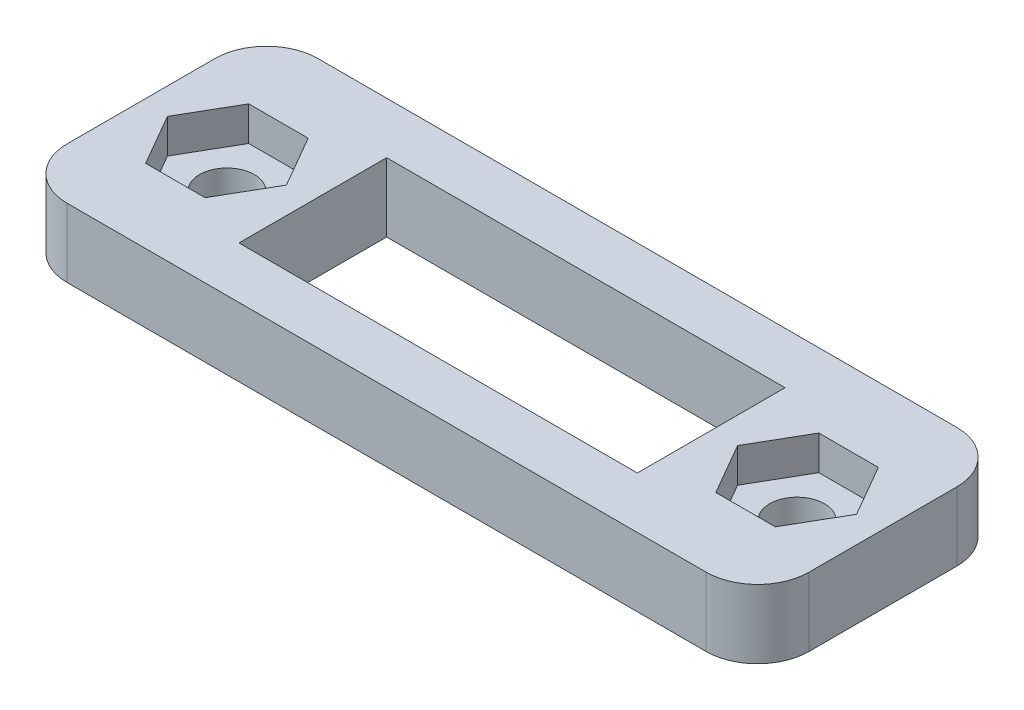
ISO-10303-21;
HEADER;
FILE_DESCRIPTION(('STEP AP214'),'2;1');
FILE_NAME('part.step','',(''),(''),'','','');
FILE_SCHEMA(('AUTOMOTIVE_DESIGN { 1 0 10303 214 1 1 1 1 }'));
ENDSEC;
DATA;
#1=APPLICATION_CONTEXT('core data for automotive mechanical design processes');
#2=APPLICATION_PROTOCOL_DEFINITION('international standard','automotive_design',2000,#1);
#3=PRODUCT_CONTEXT('',#1,'mechanical');
#4=PRODUCT('Part','Part','',(#3));
#5=PRODUCT_RELATED_PRODUCT_CATEGORY('part','',(#4));
#6=PRODUCT_DEFINITION_FORMATION('','',#4);
#7=PRODUCT_DEFINITION_CONTEXT('part definition',#1,'design');
#8=PRODUCT_DEFINITION('design','',#6,#7);
#9=PRODUCT_DEFINITION_SHAPE('','',#8);
#10=(LENGTH_UNIT() NAMED_UNIT(*) SI_UNIT(.MILLI.,.METRE.));
#11=(NAMED_UNIT(*) PLANE_ANGLE_UNIT() SI_UNIT($,.RADIAN.));
#12=(NAMED_UNIT(*) SI_UNIT($,.STERADIAN.) SOLID_ANGLE_UNIT());
#13=UNCERTAINTY_MEASURE_WITH_UNIT(LENGTH_MEASURE(1.E-05),#10,'distance_accuracy_value','');
#14=(GEOMETRIC_REPRESENTATION_CONTEXT(3) GLOBAL_UNCERTAINTY_ASSIGNED_CONTEXT((#13)) GLOBAL_UNIT_ASSIGNED_CONTEXT((#10,
#11,#12)) REPRESENTATION_CONTEXT('',''));
#15=CARTESIAN_POINT('',(0.,0.,0.));
#16=DIRECTION('',(0.,0.,1.));
#17=DIRECTION('',(1.,0.,0.));
#18=AXIS2_PLACEMENT_3D('',#15,#16,#17);
#19=CARTESIAN_POINT('',(0.,4.,0.));
#20=DIRECTION('',(0.,1.,0.));
#21=DIRECTION('',(0.,0.,1.));
#22=AXIS2_PLACEMENT_3D('',#19,#20,#21);
#23=PLANE('',#22);
#24=DIRECTION('',(0.500000000000002,0.,-0.866025403784438));
#25=VECTOR('',#24,1.);
#26=CARTESIAN_POINT('',(-13.1358983848622,4.,0.));
#27=LINE('',#26,#25);
#28=CARTESIAN_POINT('',(-14.8679491924311,4.,2.99999999999997));
#29=VERTEX_POINT('',#28);
#30=CARTESIAN_POINT('',(-13.1358983848622,4.,0.));
#31=VERTEX_POINT('',#30);
#32=EDGE_CURVE('E208',#29,#31,#27,.T.);
#33=ORIENTED_EDGE('',*,*,#32,.F.);
#34=DIRECTION('',(1.,0.,0.));
#35=VECTOR('',#34,1.);
#36=CARTESIAN_POINT('',(-14.8679491924311,4.,2.99999999999997));
#37=LINE('',#36,#35);
#38=CARTESIAN_POINT('',(-18.3320508075689,4.,2.99999999999997));
#39=VERTEX_POINT('',#38);
#40=EDGE_CURVE('E226',#39,#29,#37,.T.);
#41=ORIENTED_EDGE('',*,*,#40,.F.);
#42=DIRECTION('',(0.499999999999999,0.,0.866025403784439));
#43=VECTOR('',#42,1.);
#44=CARTESIAN_POINT('',(-18.3320508075689,4.,2.99999999999997));
#45=LINE('',#44,#43);
#46=CARTESIAN_POINT('',(-20.0641016151378,4.,0.));
#47=VERTEX_POINT('',#46);
#48=EDGE_CURVE('E229',#47,#39,#45,.T.);
#49=ORIENTED_EDGE('',*,*,#48,.F.);
#50=DIRECTION('',(-0.500000000000002,0.,0.866025403784438));
#51=VECTOR('',#50,1.);
#52=CARTESIAN_POINT('',(-20.0641016151378,4.,0.));
#53=LINE('',#52,#51);
#54=CARTESIAN_POINT('',(-18.3320508075689,4.,-3.00000000000003));
#55=VERTEX_POINT('',#54);
#56=EDGE_CURVE('E249',#55,#47,#53,.T.);
#57=ORIENTED_EDGE('',*,*,#56,.F.);
#58=DIRECTION('',(-1.,0.,0.));
#59=VECTOR('',#58,1.);
#60=CARTESIAN_POINT('',(-18.3320508075689,4.,-3.00000000000003));
#61=LINE('',#60,#59);
#62=CARTESIAN_POINT('',(-14.8679491924311,4.,-3.00000000000003));
#63=VERTEX_POINT('',#62);
#64=EDGE_CURVE('E246',#63,#55,#61,.T.);
#65=ORIENTED_EDGE('',*,*,#64,.F.);
#66=DIRECTION('',(-0.499999999999998,0.,-0.86602540378444));
#67=VECTOR('',#66,1.);
#68=CARTESIAN_POINT('',(-14.8679491924311,4.,-3.00000000000003));
#69=LINE('',#68,#67);
#70=EDGE_CURVE('E243',#31,#63,#69,.T.);
#71=ORIENTED_EDGE('',*,*,#70,.F.);
#72=EDGE_LOOP('',(#33,#41,#49,#57,#65,#71));
#73=FACE_BOUND('',#72,.T.);
#74=DIRECTION('',(1.,0.,0.));
#75=VECTOR('',#74,1.);
#76=CARTESIAN_POINT('',(14.8679491924311,4.,3.));
#77=LINE('',#76,#75);
#78=CARTESIAN_POINT('',(14.8679491924311,4.,3.));
#79=VERTEX_POINT('',#78);
#80=CARTESIAN_POINT('',(18.3320508075689,4.,3.));
#81=VERTEX_POINT('',#80);
#82=EDGE_CURVE('E284',#79,#81,#77,.T.);
#83=ORIENTED_EDGE('',*,*,#82,.F.);
#84=DIRECTION('',(0.5,0.,0.866025403784439));
#85=VECTOR('',#84,1.);
#86=CARTESIAN_POINT('',(13.1358983848622,4.,0.));
#87=LINE('',#86,#85);
#88=CARTESIAN_POINT('',(13.1358983848622,4.,0.));
#89=VERTEX_POINT('',#88);
#90=EDGE_CURVE('E268',#89,#79,#87,.T.);
#91=ORIENTED_EDGE('',*,*,#90,.F.);
#92=DIRECTION('',(-0.5,0.,0.866025403784439));
#93=VECTOR('',#92,1.);
#94=CARTESIAN_POINT('',(14.8679491924311,4.,-3.));
#95=LINE('',#94,#93);
#96=CARTESIAN_POINT('',(14.8679491924311,4.,-3.));
#97=VERTEX_POINT('',#96);
#98=EDGE_CURVE('E296',#97,#89,#95,.T.);
#99=ORIENTED_EDGE('',*,*,#98,.F.);
#100=DIRECTION('',(-1.,0.,0.));
#101=VECTOR('',#100,1.);
#102=CARTESIAN_POINT('',(18.3320508075689,4.,-3.));
#103=LINE('',#102,#101);
#104=CARTESIAN_POINT('',(18.3320508075689,4.,-3.));
#105=VERTEX_POINT('',#104);
#106=EDGE_CURVE('E293',#105,#97,#103,.T.);
#107=ORIENTED_EDGE('',*,*,#106,.F.);
#108=DIRECTION('',(-0.5,0.,-0.866025403784439));
#109=VECTOR('',#108,1.);
#110=CARTESIAN_POINT('',(20.0641016151378,4.,0.));
#111=LINE('',#110,#109);
#112=CARTESIAN_POINT('',(20.0641016151378,4.,0.));
#113=VERTEX_POINT('',#112);
#114=EDGE_CURVE('E290',#113,#105,#111,.T.);
#115=ORIENTED_EDGE('',*,*,#114,.F.);
#116=DIRECTION('',(0.500000000000001,0.,-0.866025403784438));
#117=VECTOR('',#116,1.);
#118=CARTESIAN_POINT('',(18.3320508075689,4.,3.));
#119=LINE('',#118,#117);
#120=EDGE_CURVE('E286',#81,#113,#119,.T.);
#121=ORIENTED_EDGE('',*,*,#120,.F.);
#122=EDGE_LOOP('',(#83,#91,#99,#107,#115,#121));
#123=FACE_BOUND('',#122,.T.);
#124=DIRECTION('',(0.,0.,-1.));
#125=VECTOR('',#124,1.);
#126=CARTESIAN_POINT('',(21.6,4.,-7.3));
#127=LINE('',#126,#125);
#128=CARTESIAN_POINT('',(21.6,4.,4.3));
#129=VERTEX_POINT('',#128);
#130=CARTESIAN_POINT('',(21.6,4.,-4.3));
#131=VERTEX_POINT('',#130);
#132=EDGE_CURVE('E348',#129,#131,#127,.T.);
#133=ORIENTED_EDGE('',*,*,#132,.T.);
#134=CARTESIAN_POINT('',(18.6,4.,-4.3));
#135=DIRECTION('',(0.,1.,0.));
#136=DIRECTION('',(0.,0.,1.));
#137=AXIS2_PLACEMENT_3D('',#134,#135,#136);
#138=CIRCLE('',#137,3.);
#139=CARTESIAN_POINT('',(18.6,4.,-7.3));
#140=VERTEX_POINT('',#139);
#141=EDGE_CURVE('E386',#131,#140,#138,.T.);
#142=ORIENTED_EDGE('',*,*,#141,.T.);
#143=DIRECTION('',(-1.,0.,0.));
#144=VECTOR('',#143,1.);
#145=CARTESIAN_POINT('',(-21.6,4.,-7.3));
#146=LINE('',#145,#144);
#147=CARTESIAN_POINT('',(-18.6,4.,-7.3));
#148=VERTEX_POINT('',#147);
#149=EDGE_CURVE('E351',#140,#148,#146,.T.);
#150=ORIENTED_EDGE('',*,*,#149,.T.);
#151=CARTESIAN_POINT('',(-18.6,4.,-4.3));
#152=DIRECTION('',(0.,1.,0.));
#153=DIRECTION('',(0.,0.,1.));
#154=AXIS2_PLACEMENT_3D('',#151,#152,#153);
#155=CIRCLE('',#154,3.);
#156=CARTESIAN_POINT('',(-21.6,4.,-4.3));
#157=VERTEX_POINT('',#156);
#158=EDGE_CURVE('E384',#148,#157,#155,.T.);
#159=ORIENTED_EDGE('',*,*,#158,.T.);
#160=DIRECTION('',(0.,0.,1.));
#161=VECTOR('',#160,1.);
#162=CARTESIAN_POINT('',(-21.6,4.,-7.3));
#163=LINE('',#162,#161);
#164=CARTESIAN_POINT('',(-21.6,4.,4.3));
#165=VERTEX_POINT('',#164);
#166=EDGE_CURVE('E343',#157,#165,#163,.T.);
#167=ORIENTED_EDGE('',*,*,#166,.T.);
#168=CARTESIAN_POINT('',(-18.6,4.,4.3));
#169=DIRECTION('',(0.,1.,0.));
#170=DIRECTION('',(0.,0.,1.));
#171=AXIS2_PLACEMENT_3D('',#168,#169,#170);
#172=CIRCLE('',#171,3.);
#173=CARTESIAN_POINT('',(-18.6,4.,7.3));
#174=VERTEX_POINT('',#173);
#175=EDGE_CURVE('E60',#165,#174,#172,.T.);
#176=ORIENTED_EDGE('',*,*,#175,.T.);
#177=DIRECTION('',(1.,0.,0.));
#178=VECTOR('',#177,1.);
#179=CARTESIAN_POINT('',(-21.6,4.,7.3));
#180=LINE('',#179,#178);
#181=CARTESIAN_POINT('',(18.6,4.,7.3));
#182=VERTEX_POINT('',#181);
#183=EDGE_CURVE('E345',#174,#182,#180,.T.);
#184=ORIENTED_EDGE('',*,*,#183,.T.);
#185=CARTESIAN_POINT('',(18.6,4.,4.3));
#186=DIRECTION('',(0.,1.,0.));
#187=DIRECTION('',(0.,0.,1.));
#188=AXIS2_PLACEMENT_3D('',#185,#186,#187);
#189=CIRCLE('',#188,3.);
#190=EDGE_CURVE('E381',#182,#129,#189,.T.);
#191=ORIENTED_EDGE('',*,*,#190,.T.);
#192=EDGE_LOOP('',(#133,#142,#150,#159,#167,#176,#184,#191));
#193=FACE_BOUND('',#192,.T.);
#194=DIRECTION('',(1.,0.,0.));
#195=VECTOR('',#194,1.);
#196=CARTESIAN_POINT('',(-11.6,4.,4.3));
#197=LINE('',#196,#195);
#198=CARTESIAN_POINT('',(-11.6,4.,4.3));
#199=VERTEX_POINT('',#198);
#200=CARTESIAN_POINT('',(11.6,4.,4.3));
#201=VERTEX_POINT('',#200);
#202=EDGE_CURVE('E314',#199,#201,#197,.T.);
#203=ORIENTED_EDGE('',*,*,#202,.F.);
#204=DIRECTION('',(0.,0.,1.));
#205=VECTOR('',#204,1.);
#206=CARTESIAN_POINT('',(-11.6,4.,-4.3));
#207=LINE('',#206,#205);
#208=CARTESIAN_POINT('',(-11.6,4.,-4.3));
#209=VERTEX_POINT('',#208);
#210=EDGE_CURVE('E312',#209,#199,#207,.T.);
#211=ORIENTED_EDGE('',*,*,#210,.F.);
#212=DIRECTION('',(-1.,0.,0.));
#213=VECTOR('',#212,1.);
#214=CARTESIAN_POINT('',(-11.6,4.,-4.3));
#215=LINE('',#214,#213);
#216=CARTESIAN_POINT('',(11.6,4.,-4.3));
#217=VERTEX_POINT('',#216);
#218=EDGE_CURVE('E320',#217,#209,#215,.T.);
#219=ORIENTED_EDGE('',*,*,#218,.F.);
#220=DIRECTION('',(0.,0.,-1.));
#221=VECTOR('',#220,1.);
#222=CARTESIAN_POINT('',(11.6,4.,-4.3));
#223=LINE('',#222,#221);
#224=EDGE_CURVE('E317',#201,#217,#223,.T.);
#225=ORIENTED_EDGE('',*,*,#224,.F.);
#226=EDGE_LOOP('',(#203,#211,#219,#225));
#227=FACE_BOUND('',#226,.T.);
#228=ADVANCED_FACE('F39',(#73,#123,#193,#227),#23,.T.);
#229=CARTESIAN_POINT('',(0.,0.,0.));
#230=DIRECTION('',(0.,1.,0.));
#231=DIRECTION('',(0.,0.,1.));
#232=AXIS2_PLACEMENT_3D('',#229,#230,#231);
#233=PLANE('',#232);
#234=CARTESIAN_POINT('',(-16.6,0.,0.));
#235=DIRECTION('',(0.,1.,0.));
#236=DIRECTION('',(0.,0.,1.));
#237=AXIS2_PLACEMENT_3D('',#234,#235,#236);
#238=CIRCLE('',#237,1.6);
#239=CARTESIAN_POINT('',(-16.6,0.,1.6));
#240=VERTEX_POINT('',#239);
#241=EDGE_CURVE('E287',#240,#240,#238,.T.);
#242=ORIENTED_EDGE('',*,*,#241,.T.);
#243=EDGE_LOOP('',(#242));
#244=FACE_BOUND('',#243,.T.);
#245=CARTESIAN_POINT('',(16.6,0.,0.));
#246=DIRECTION('',(0.,1.,0.));
#247=DIRECTION('',(0.,0.,-1.));
#248=AXIS2_PLACEMENT_3D('',#245,#246,#247);
#249=CIRCLE('',#248,1.6);
#250=CARTESIAN_POINT('',(16.6,0.,-1.6));
#251=VERTEX_POINT('',#250);
#252=EDGE_CURVE('E664',#251,#251,#249,.T.);
#253=ORIENTED_EDGE('',*,*,#252,.T.);
#254=EDGE_LOOP('',(#253));
#255=FACE_BOUND('',#254,.T.);
#256=DIRECTION('',(-1.,0.,0.));
#257=VECTOR('',#256,1.);
#258=CARTESIAN_POINT('',(-21.6,0.,-7.3));
#259=LINE('',#258,#257);
#260=CARTESIAN_POINT('',(18.6,0.,-7.3));
#261=VERTEX_POINT('',#260);
#262=CARTESIAN_POINT('',(-18.6,0.,-7.3));
#263=VERTEX_POINT('',#262);
#264=EDGE_CURVE('E346',#261,#263,#259,.T.);
#265=ORIENTED_EDGE('',*,*,#264,.F.);
#266=CARTESIAN_POINT('',(18.6,0.,-4.3));
#267=DIRECTION('',(0.,1.,0.));
#268=DIRECTION('',(0.,0.,1.));
#269=AXIS2_PLACEMENT_3D('',#266,#267,#268);
#270=CIRCLE('',#269,3.);
#271=CARTESIAN_POINT('',(21.6,0.,-4.3));
#272=VERTEX_POINT('',#271);
#273=EDGE_CURVE('E374',#261,#272,#270,.F.);
#274=ORIENTED_EDGE('',*,*,#273,.T.);
#275=DIRECTION('',(0.,0.,-1.));
#276=VECTOR('',#275,1.);
#277=CARTESIAN_POINT('',(21.6,0.,-7.3));
#278=LINE('',#277,#276);
#279=CARTESIAN_POINT('',(21.6,0.,4.3));
#280=VERTEX_POINT('',#279);
#281=EDGE_CURVE('E359',#280,#272,#278,.T.);
#282=ORIENTED_EDGE('',*,*,#281,.F.);
#283=CARTESIAN_POINT('',(18.6,0.,4.3));
#284=DIRECTION('',(0.,1.,0.));
#285=DIRECTION('',(0.,0.,1.));
#286=AXIS2_PLACEMENT_3D('',#283,#284,#285);
#287=CIRCLE('',#286,3.);
#288=CARTESIAN_POINT('',(18.6,0.,7.3));
#289=VERTEX_POINT('',#288);
#290=EDGE_CURVE('E368',#280,#289,#287,.F.);
#291=ORIENTED_EDGE('',*,*,#290,.T.);
#292=DIRECTION('',(1.,0.,0.));
#293=VECTOR('',#292,1.);
#294=CARTESIAN_POINT('',(-21.6,0.,7.3));
#295=LINE('',#294,#293);
#296=CARTESIAN_POINT('',(-18.6,0.,7.3));
#297=VERTEX_POINT('',#296);
#298=EDGE_CURVE('E357',#297,#289,#295,.T.);
#299=ORIENTED_EDGE('',*,*,#298,.F.);
#300=CARTESIAN_POINT('',(-18.6,0.,4.3));
#301=DIRECTION('',(0.,1.,0.));
#302=DIRECTION('',(0.,0.,1.));
#303=AXIS2_PLACEMENT_3D('',#300,#301,#302);
#304=CIRCLE('',#303,3.);
#305=CARTESIAN_POINT('',(-21.6,0.,4.3));
#306=VERTEX_POINT('',#305);
#307=EDGE_CURVE('E370',#297,#306,#304,.F.);
#308=ORIENTED_EDGE('',*,*,#307,.T.);
#309=DIRECTION('',(0.,0.,1.));
#310=VECTOR('',#309,1.);
#311=CARTESIAN_POINT('',(-21.6,0.,-7.3));
#312=LINE('',#311,#310);
#313=CARTESIAN_POINT('',(-21.6,0.,-4.3));
#314=VERTEX_POINT('',#313);
#315=EDGE_CURVE('E342',#314,#306,#312,.T.);
#316=ORIENTED_EDGE('',*,*,#315,.F.);
#317=CARTESIAN_POINT('',(-18.6,0.,-4.3));
#318=DIRECTION('',(0.,1.,0.));
#319=DIRECTION('',(0.,0.,1.));
#320=AXIS2_PLACEMENT_3D('',#317,#318,#319);
#321=CIRCLE('',#320,3.);
#322=EDGE_CURVE('E372',#314,#263,#321,.F.);
#323=ORIENTED_EDGE('',*,*,#322,.T.);
#324=EDGE_LOOP('',(#265,#274,#282,#291,#299,#308,#316,#323));
#325=FACE_BOUND('',#324,.T.);
#326=DIRECTION('',(0.,0.,1.));
#327=VECTOR('',#326,1.);
#328=CARTESIAN_POINT('',(-11.6,0.,-4.3));
#329=LINE('',#328,#327);
#330=CARTESIAN_POINT('',(-11.6,0.,-4.3));
#331=VERTEX_POINT('',#330);
#332=CARTESIAN_POINT('',(-11.6,0.,4.3));
#333=VERTEX_POINT('',#332);
#334=EDGE_CURVE('E256',#331,#333,#329,.T.);
#335=ORIENTED_EDGE('',*,*,#334,.T.);
#336=DIRECTION('',(1.,0.,0.));
#337=VECTOR('',#336,1.);
#338=CARTESIAN_POINT('',(-11.6,0.,4.3));
#339=LINE('',#338,#337);
#340=CARTESIAN_POINT('',(11.6,0.,4.3));
#341=VERTEX_POINT('',#340);
#342=EDGE_CURVE('E325',#333,#341,#339,.T.);
#343=ORIENTED_EDGE('',*,*,#342,.T.);
#344=DIRECTION('',(0.,0.,-1.));
#345=VECTOR('',#344,1.);
#346=CARTESIAN_POINT('',(11.6,0.,-4.3));
#347=LINE('',#346,#345);
#348=CARTESIAN_POINT('',(11.6,0.,-4.3));
#349=VERTEX_POINT('',#348);
#350=EDGE_CURVE('E328',#341,#349,#347,.T.);
#351=ORIENTED_EDGE('',*,*,#350,.T.);
#352=DIRECTION('',(-1.,0.,0.));
#353=VECTOR('',#352,1.);
#354=CARTESIAN_POINT('',(-11.6,0.,-4.3));
#355=LINE('',#354,#353);
#356=EDGE_CURVE('E315',#349,#331,#355,.T.);
#357=ORIENTED_EDGE('',*,*,#356,.T.);
#358=EDGE_LOOP('',(#335,#343,#351,#357));
#359=FACE_BOUND('',#358,.T.);
#360=ADVANCED_FACE('F402',(#244,#255,#325,#359),#233,.F.);
#361=CARTESIAN_POINT('',(-21.6,4.,-7.3));
#362=DIRECTION('',(1.,0.,0.));
#363=DIRECTION('',(0.,0.,-1.));
#364=AXIS2_PLACEMENT_3D('',#361,#362,#363);
#365=PLANE('',#364);
#366=ORIENTED_EDGE('',*,*,#166,.F.);
#367=DIRECTION('',(0.,-1.,0.));
#368=VECTOR('',#367,1.);
#369=CARTESIAN_POINT('',(-21.6,4.,-4.3));
#370=LINE('',#369,#368);
#371=EDGE_CURVE('E390',#157,#314,#370,.T.);
#372=ORIENTED_EDGE('',*,*,#371,.T.);
#373=ORIENTED_EDGE('',*,*,#315,.T.);
#374=DIRECTION('',(0.,-1.,0.));
#375=VECTOR('',#374,1.);
#376=CARTESIAN_POINT('',(-21.6,4.,4.3));
#377=LINE('',#376,#375);
#378=EDGE_CURVE('E388',#306,#165,#377,.F.);
#379=ORIENTED_EDGE('',*,*,#378,.T.);
#380=EDGE_LOOP('',(#366,#372,#373,#379));
#381=FACE_BOUND('',#380,.T.);
#382=ADVANCED_FACE('F396',(#381),#365,.F.);
#383=CARTESIAN_POINT('',(-21.6,4.,7.3));
#384=DIRECTION('',(0.,0.,-1.));
#385=DIRECTION('',(-1.,0.,0.));
#386=AXIS2_PLACEMENT_3D('',#383,#384,#385);
#387=PLANE('',#386);
#388=ORIENTED_EDGE('',*,*,#183,.F.);
#389=DIRECTION('',(0.,-1.,0.));
#390=VECTOR('',#389,1.);
#391=CARTESIAN_POINT('',(-18.6,4.,7.3));
#392=LINE('',#391,#390);
#393=EDGE_CURVE('E11',#174,#297,#392,.T.);
#394=ORIENTED_EDGE('',*,*,#393,.T.);
#395=ORIENTED_EDGE('',*,*,#298,.T.);
#396=DIRECTION('',(0.,-1.,0.));
#397=VECTOR('',#396,1.);
#398=CARTESIAN_POINT('',(18.6,4.,7.3));
#399=LINE('',#398,#397);
#400=EDGE_CURVE('E47',#289,#182,#399,.F.);
#401=ORIENTED_EDGE('',*,*,#400,.T.);
#402=EDGE_LOOP('',(#388,#394,#395,#401));
#403=FACE_BOUND('',#402,.T.);
#404=ADVANCED_FACE('F408',(#403),#387,.F.);
#405=CARTESIAN_POINT('',(21.6,4.,-7.3));
#406=DIRECTION('',(-1.,0.,0.));
#407=DIRECTION('',(0.,0.,1.));
#408=AXIS2_PLACEMENT_3D('',#405,#406,#407);
#409=PLANE('',#408);
#410=ORIENTED_EDGE('',*,*,#281,.T.);
#411=DIRECTION('',(0.,-1.,0.));
#412=VECTOR('',#411,1.);
#413=CARTESIAN_POINT('',(21.6,4.,-4.3));
#414=LINE('',#413,#412);
#415=EDGE_CURVE('E379',#272,#131,#414,.F.);
#416=ORIENTED_EDGE('',*,*,#415,.T.);
#417=ORIENTED_EDGE('',*,*,#132,.F.);
#418=DIRECTION('',(0.,-1.,0.));
#419=VECTOR('',#418,1.);
#420=CARTESIAN_POINT('',(21.6,4.,4.3));
#421=LINE('',#420,#419);
#422=EDGE_CURVE('E376',#129,#280,#421,.T.);
#423=ORIENTED_EDGE('',*,*,#422,.T.);
#424=EDGE_LOOP('',(#410,#416,#417,#423));
#425=FACE_BOUND('',#424,.T.);
#426=ADVANCED_FACE('F416',(#425),#409,.F.);
#427=CARTESIAN_POINT('',(-21.6,4.,-7.3));
#428=DIRECTION('',(0.,0.,1.));
#429=DIRECTION('',(1.,0.,0.));
#430=AXIS2_PLACEMENT_3D('',#427,#428,#429);
#431=PLANE('',#430);
#432=ORIENTED_EDGE('',*,*,#149,.F.);
#433=DIRECTION('',(0.,-1.,0.));
#434=VECTOR('',#433,1.);
#435=CARTESIAN_POINT('',(18.6,4.,-7.3));
#436=LINE('',#435,#434);
#437=EDGE_CURVE('E365',#140,#261,#436,.T.);
#438=ORIENTED_EDGE('',*,*,#437,.T.);
#439=ORIENTED_EDGE('',*,*,#264,.T.);
#440=DIRECTION('',(0.,-1.,0.));
#441=VECTOR('',#440,1.);
#442=CARTESIAN_POINT('',(-18.6,4.,-7.3));
#443=LINE('',#442,#441);
#444=EDGE_CURVE('E354',#263,#148,#443,.F.);
#445=ORIENTED_EDGE('',*,*,#444,.T.);
#446=EDGE_LOOP('',(#432,#438,#439,#445));
#447=FACE_BOUND('',#446,.T.);
#448=ADVANCED_FACE('F424',(#447),#431,.F.);
#449=CARTESIAN_POINT('',(-11.6,4.,-4.3));
#450=DIRECTION('',(1.,0.,0.));
#451=DIRECTION('',(0.,0.,-1.));
#452=AXIS2_PLACEMENT_3D('',#449,#450,#451);
#453=PLANE('',#452);
#454=ORIENTED_EDGE('',*,*,#334,.F.);
#455=DIRECTION('',(0.,-1.,0.));
#456=VECTOR('',#455,1.);
#457=CARTESIAN_POINT('',(-11.6,4.,-4.3));
#458=LINE('',#457,#456);
#459=EDGE_CURVE('E322',#209,#331,#458,.T.);
#460=ORIENTED_EDGE('',*,*,#459,.F.);
#461=ORIENTED_EDGE('',*,*,#210,.T.);
#462=DIRECTION('',(0.,-1.,0.));
#463=VECTOR('',#462,1.);
#464=CARTESIAN_POINT('',(-11.6,4.,4.3));
#465=LINE('',#464,#463);
#466=EDGE_CURVE('E339',#199,#333,#465,.T.);
#467=ORIENTED_EDGE('',*,*,#466,.T.);
#468=EDGE_LOOP('',(#454,#460,#461,#467));
#469=FACE_BOUND('',#468,.T.);
#470=ADVANCED_FACE('F446',(#469),#453,.T.);
#471=CARTESIAN_POINT('',(-11.6,4.,4.3));
#472=DIRECTION('',(0.,0.,-1.));
#473=DIRECTION('',(-1.,0.,0.));
#474=AXIS2_PLACEMENT_3D('',#471,#472,#473);
#475=PLANE('',#474);
#476=ORIENTED_EDGE('',*,*,#342,.F.);
#477=ORIENTED_EDGE('',*,*,#466,.F.);
#478=ORIENTED_EDGE('',*,*,#202,.T.);
#479=DIRECTION('',(0.,-1.,0.));
#480=VECTOR('',#479,1.);
#481=CARTESIAN_POINT('',(11.6,4.,4.3));
#482=LINE('',#481,#480);
#483=EDGE_CURVE('E337',#201,#341,#482,.T.);
#484=ORIENTED_EDGE('',*,*,#483,.T.);
#485=EDGE_LOOP('',(#476,#477,#478,#484));
#486=FACE_BOUND('',#485,.T.);
#487=ADVANCED_FACE('F625',(#486),#475,.T.);
#488=CARTESIAN_POINT('',(11.6,4.,-4.3));
#489=DIRECTION('',(-1.,0.,0.));
#490=DIRECTION('',(0.,0.,1.));
#491=AXIS2_PLACEMENT_3D('',#488,#489,#490);
#492=PLANE('',#491);
#493=ORIENTED_EDGE('',*,*,#350,.F.);
#494=ORIENTED_EDGE('',*,*,#483,.F.);
#495=ORIENTED_EDGE('',*,*,#224,.T.);
#496=DIRECTION('',(0.,-1.,0.));
#497=VECTOR('',#496,1.);
#498=CARTESIAN_POINT('',(11.6,4.,-4.3));
#499=LINE('',#498,#497);
#500=EDGE_CURVE('E335',#217,#349,#499,.T.);
#501=ORIENTED_EDGE('',*,*,#500,.T.);
#502=EDGE_LOOP('',(#493,#494,#495,#501));
#503=FACE_BOUND('',#502,.T.);
#504=ADVANCED_FACE('F617',(#503),#492,.T.);
#505=CARTESIAN_POINT('',(-11.6,4.,-4.3));
#506=DIRECTION('',(0.,0.,1.));
#507=DIRECTION('',(1.,0.,0.));
#508=AXIS2_PLACEMENT_3D('',#505,#506,#507);
#509=PLANE('',#508);
#510=ORIENTED_EDGE('',*,*,#356,.F.);
#511=ORIENTED_EDGE('',*,*,#500,.F.);
#512=ORIENTED_EDGE('',*,*,#218,.T.);
#513=ORIENTED_EDGE('',*,*,#459,.T.);
#514=EDGE_LOOP('',(#510,#511,#512,#513));
#515=FACE_BOUND('',#514,.T.);
#516=ADVANCED_FACE('F609',(#515),#509,.T.);
#517=CARTESIAN_POINT('',(14.8679491924311,2.,3.));
#518=DIRECTION('',(0.,0.,1.));
#519=DIRECTION('',(1.,0.,0.));
#520=AXIS2_PLACEMENT_3D('',#517,#518,#519);
#521=PLANE('',#520);
#522=ORIENTED_EDGE('',*,*,#82,.T.);
#523=DIRECTION('',(0.,1.,0.));
#524=VECTOR('',#523,1.);
#525=CARTESIAN_POINT('',(18.3320508075689,2.,3.));
#526=LINE('',#525,#524);
#527=CARTESIAN_POINT('',(18.3320508075689,2.,3.));
#528=VERTEX_POINT('',#527);
#529=EDGE_CURVE('E283',#528,#81,#526,.T.);
#530=ORIENTED_EDGE('',*,*,#529,.F.);
#531=DIRECTION('',(1.,0.,0.));
#532=VECTOR('',#531,1.);
#533=CARTESIAN_POINT('',(14.8679491924311,2.,3.));
#534=LINE('',#533,#532);
#535=CARTESIAN_POINT('',(14.8679491924311,2.,3.));
#536=VERTEX_POINT('',#535);
#537=EDGE_CURVE('E264',#536,#528,#534,.T.);
#538=ORIENTED_EDGE('',*,*,#537,.F.);
#539=DIRECTION('',(0.,1.,0.));
#540=VECTOR('',#539,1.);
#541=CARTESIAN_POINT('',(14.8679491924311,2.,3.));
#542=LINE('',#541,#540);
#543=EDGE_CURVE('E244',#536,#79,#542,.T.);
#544=ORIENTED_EDGE('',*,*,#543,.T.);
#545=EDGE_LOOP('',(#522,#530,#538,#544));
#546=FACE_BOUND('',#545,.T.);
#547=ADVANCED_FACE('F601',(#546),#521,.F.);
#548=CARTESIAN_POINT('',(13.1358983848622,2.,0.));
#549=DIRECTION('',(-0.866025403784439,0.,0.5));
#550=DIRECTION('',(0.5,0.,0.866025403784439));
#551=AXIS2_PLACEMENT_3D('',#548,#549,#550);
#552=PLANE('',#551);
#553=ORIENTED_EDGE('',*,*,#90,.T.);
#554=ORIENTED_EDGE('',*,*,#543,.F.);
#555=DIRECTION('',(0.5,0.,0.866025403784439));
#556=VECTOR('',#555,1.);
#557=CARTESIAN_POINT('',(13.1358983848622,2.,0.));
#558=LINE('',#557,#556);
#559=CARTESIAN_POINT('',(13.1358983848622,2.,0.));
#560=VERTEX_POINT('',#559);
#561=EDGE_CURVE('E280',#560,#536,#558,.T.);
#562=ORIENTED_EDGE('',*,*,#561,.F.);
#563=DIRECTION('',(0.,1.,0.));
#564=VECTOR('',#563,1.);
#565=CARTESIAN_POINT('',(13.1358983848622,2.,0.));
#566=LINE('',#565,#564);
#567=EDGE_CURVE('E302',#560,#89,#566,.T.);
#568=ORIENTED_EDGE('',*,*,#567,.T.);
#569=EDGE_LOOP('',(#553,#554,#562,#568));
#570=FACE_BOUND('',#569,.T.);
#571=ADVANCED_FACE('F593',(#570),#552,.F.);
#572=CARTESIAN_POINT('',(14.8679491924311,2.,-3.));
#573=DIRECTION('',(-0.866025403784439,0.,-0.5));
#574=DIRECTION('',(-0.5,0.,0.866025403784439));
#575=AXIS2_PLACEMENT_3D('',#572,#573,#574);
#576=PLANE('',#575);
#577=ORIENTED_EDGE('',*,*,#98,.T.);
#578=ORIENTED_EDGE('',*,*,#567,.F.);
#579=DIRECTION('',(-0.5,0.,0.866025403784439));
#580=VECTOR('',#579,1.);
#581=CARTESIAN_POINT('',(14.8679491924311,2.,-3.));
#582=LINE('',#581,#580);
#583=CARTESIAN_POINT('',(14.8679491924311,2.,-3.));
#584=VERTEX_POINT('',#583);
#585=EDGE_CURVE('E277',#584,#560,#582,.T.);
#586=ORIENTED_EDGE('',*,*,#585,.F.);
#587=DIRECTION('',(0.,1.,0.));
#588=VECTOR('',#587,1.);
#589=CARTESIAN_POINT('',(14.8679491924311,2.,-3.));
#590=LINE('',#589,#588);
#591=EDGE_CURVE('E304',#584,#97,#590,.T.);
#592=ORIENTED_EDGE('',*,*,#591,.T.);
#593=EDGE_LOOP('',(#577,#578,#586,#592));
#594=FACE_BOUND('',#593,.T.);
#595=ADVANCED_FACE('F585',(#594),#576,.F.);
#596=CARTESIAN_POINT('',(18.3320508075689,2.,-3.));
#597=DIRECTION('',(0.,0.,-1.));
#598=DIRECTION('',(-1.,0.,0.));
#599=AXIS2_PLACEMENT_3D('',#596,#597,#598);
#600=PLANE('',#599);
#601=ORIENTED_EDGE('',*,*,#106,.T.);
#602=ORIENTED_EDGE('',*,*,#591,.F.);
#603=DIRECTION('',(-1.,0.,0.));
#604=VECTOR('',#603,1.);
#605=CARTESIAN_POINT('',(18.3320508075689,2.,-3.));
#606=LINE('',#605,#604);
#607=CARTESIAN_POINT('',(18.3320508075689,2.,-3.));
#608=VERTEX_POINT('',#607);
#609=EDGE_CURVE('E274',#608,#584,#606,.T.);
#610=ORIENTED_EDGE('',*,*,#609,.F.);
#611=DIRECTION('',(0.,1.,0.));
#612=VECTOR('',#611,1.);
#613=CARTESIAN_POINT('',(18.3320508075689,2.,-3.));
#614=LINE('',#613,#612);
#615=EDGE_CURVE('E306',#608,#105,#614,.T.);
#616=ORIENTED_EDGE('',*,*,#615,.T.);
#617=EDGE_LOOP('',(#601,#602,#610,#616));
#618=FACE_BOUND('',#617,.T.);
#619=ADVANCED_FACE('F577',(#618),#600,.F.);
#620=CARTESIAN_POINT('',(20.0641016151378,2.,0.));
#621=DIRECTION('',(0.866025403784439,0.,-0.5));
#622=DIRECTION('',(-0.5,0.,-0.866025403784439));
#623=AXIS2_PLACEMENT_3D('',#620,#621,#622);
#624=PLANE('',#623);
#625=ORIENTED_EDGE('',*,*,#114,.T.);
#626=ORIENTED_EDGE('',*,*,#615,.F.);
#627=DIRECTION('',(-0.5,0.,-0.866025403784439));
#628=VECTOR('',#627,1.);
#629=CARTESIAN_POINT('',(20.0641016151378,2.,0.));
#630=LINE('',#629,#628);
#631=CARTESIAN_POINT('',(20.0641016151378,2.,0.));
#632=VERTEX_POINT('',#631);
#633=EDGE_CURVE('E271',#632,#608,#630,.T.);
#634=ORIENTED_EDGE('',*,*,#633,.F.);
#635=DIRECTION('',(0.,1.,0.));
#636=VECTOR('',#635,1.);
#637=CARTESIAN_POINT('',(20.0641016151378,2.,0.));
#638=LINE('',#637,#636);
#639=EDGE_CURVE('E308',#632,#113,#638,.T.);
#640=ORIENTED_EDGE('',*,*,#639,.T.);
#641=EDGE_LOOP('',(#625,#626,#634,#640));
#642=FACE_BOUND('',#641,.T.);
#643=ADVANCED_FACE('F569',(#642),#624,.F.);
#644=CARTESIAN_POINT('',(18.3320508075689,2.,3.));
#645=DIRECTION('',(0.866025403784438,0.,0.500000000000001));
#646=DIRECTION('',(0.500000000000001,0.,-0.866025403784438));
#647=AXIS2_PLACEMENT_3D('',#644,#645,#646);
#648=PLANE('',#647);
#649=ORIENTED_EDGE('',*,*,#120,.T.);
#650=ORIENTED_EDGE('',*,*,#639,.F.);
#651=DIRECTION('',(0.500000000000001,0.,-0.866025403784438));
#652=VECTOR('',#651,1.);
#653=CARTESIAN_POINT('',(18.3320508075689,2.,3.));
#654=LINE('',#653,#652);
#655=EDGE_CURVE('E267',#528,#632,#654,.T.);
#656=ORIENTED_EDGE('',*,*,#655,.F.);
#657=ORIENTED_EDGE('',*,*,#529,.T.);
#658=EDGE_LOOP('',(#649,#650,#656,#657));
#659=FACE_BOUND('',#658,.T.);
#660=ADVANCED_FACE('F562',(#659),#648,.F.);
#661=CARTESIAN_POINT('',(0.,2.,0.));
#662=DIRECTION('',(0.,1.,0.));
#663=DIRECTION('',(0.,0.,1.));
#664=AXIS2_PLACEMENT_3D('',#661,#662,#663);
#665=PLANE('',#664);
#666=CARTESIAN_POINT('',(16.6,2.,0.));
#667=DIRECTION('',(0.,1.,0.));
#668=DIRECTION('',(0.,0.,-1.));
#669=AXIS2_PLACEMENT_3D('',#666,#667,#668);
#670=CIRCLE('',#669,1.6);
#671=CARTESIAN_POINT('',(16.6,2.,-1.6));
#672=VERTEX_POINT('',#671);
#673=EDGE_CURVE('E232',#672,#672,#670,.T.);
#674=ORIENTED_EDGE('',*,*,#673,.F.);
#675=EDGE_LOOP('',(#674));
#676=FACE_BOUND('',#675,.T.);
#677=ORIENTED_EDGE('',*,*,#537,.T.);
#678=ORIENTED_EDGE('',*,*,#655,.T.);
#679=ORIENTED_EDGE('',*,*,#633,.T.);
#680=ORIENTED_EDGE('',*,*,#609,.T.);
#681=ORIENTED_EDGE('',*,*,#585,.T.);
#682=ORIENTED_EDGE('',*,*,#561,.T.);
#683=EDGE_LOOP('',(#677,#678,#679,#680,#681,#682));
#684=FACE_BOUND('',#683,.T.);
#685=ADVANCED_FACE('F555',(#676,#684),#665,.T.);
#686=CARTESIAN_POINT('',(-13.1358983848622,2.,0.));
#687=DIRECTION('',(0.866025403784438,0.,0.500000000000002));
#688=DIRECTION('',(0.500000000000002,0.,-0.866025403784438));
#689=AXIS2_PLACEMENT_3D('',#686,#687,#688);
#690=PLANE('',#689);
#691=ORIENTED_EDGE('',*,*,#32,.T.);
#692=DIRECTION('',(0.,1.,0.));
#693=VECTOR('',#692,1.);
#694=CARTESIAN_POINT('',(-13.1358983848622,2.,0.));
#695=LINE('',#694,#693);
#696=CARTESIAN_POINT('',(-13.1358983848622,2.,0.));
#697=VERTEX_POINT('',#696);
#698=EDGE_CURVE('E201',#697,#31,#695,.T.);
#699=ORIENTED_EDGE('',*,*,#698,.F.);
#700=DIRECTION('',(0.500000000000002,0.,-0.866025403784438));
#701=VECTOR('',#700,1.);
#702=CARTESIAN_POINT('',(-13.1358983848622,2.,0.));
#703=LINE('',#702,#701);
#704=CARTESIAN_POINT('',(-14.8679491924311,2.,2.99999999999997));
#705=VERTEX_POINT('',#704);
#706=EDGE_CURVE('E205',#705,#697,#703,.T.);
#707=ORIENTED_EDGE('',*,*,#706,.F.);
#708=DIRECTION('',(0.,1.,0.));
#709=VECTOR('',#708,1.);
#710=CARTESIAN_POINT('',(-14.8679491924311,2.,2.99999999999997));
#711=LINE('',#710,#709);
#712=EDGE_CURVE('E254',#705,#29,#711,.T.);
#713=ORIENTED_EDGE('',*,*,#712,.T.);
#714=EDGE_LOOP('',(#691,#699,#707,#713));
#715=FACE_BOUND('',#714,.T.);
#716=ADVANCED_FACE('F203',(#715),#690,.F.);
#717=CARTESIAN_POINT('',(-14.8679491924311,2.,2.99999999999997));
#718=DIRECTION('',(0.,0.,1.));
#719=DIRECTION('',(1.,0.,0.));
#720=AXIS2_PLACEMENT_3D('',#717,#718,#719);
#721=PLANE('',#720);
#722=ORIENTED_EDGE('',*,*,#40,.T.);
#723=ORIENTED_EDGE('',*,*,#712,.F.);
#724=DIRECTION('',(1.,0.,0.));
#725=VECTOR('',#724,1.);
#726=CARTESIAN_POINT('',(-14.8679491924311,2.,2.99999999999997));
#727=LINE('',#726,#725);
#728=CARTESIAN_POINT('',(-18.3320508075689,2.,2.99999999999997));
#729=VERTEX_POINT('',#728);
#730=EDGE_CURVE('E213',#729,#705,#727,.T.);
#731=ORIENTED_EDGE('',*,*,#730,.F.);
#732=DIRECTION('',(0.,1.,0.));
#733=VECTOR('',#732,1.);
#734=CARTESIAN_POINT('',(-18.3320508075689,2.,2.99999999999997));
#735=LINE('',#734,#733);
#736=EDGE_CURVE('E257',#729,#39,#735,.T.);
#737=ORIENTED_EDGE('',*,*,#736,.T.);
#738=EDGE_LOOP('',(#722,#723,#731,#737));
#739=FACE_BOUND('',#738,.T.);
#740=ADVANCED_FACE('F540',(#739),#721,.F.);
#741=CARTESIAN_POINT('',(-18.3320508075689,2.,2.99999999999997));
#742=DIRECTION('',(-0.866025403784439,0.,0.499999999999999));
#743=DIRECTION('',(0.499999999999999,0.,0.866025403784439));
#744=AXIS2_PLACEMENT_3D('',#741,#742,#743);
#745=PLANE('',#744);
#746=ORIENTED_EDGE('',*,*,#48,.T.);
#747=ORIENTED_EDGE('',*,*,#736,.F.);
#748=DIRECTION('',(0.499999999999999,0.,0.866025403784439));
#749=VECTOR('',#748,1.);
#750=CARTESIAN_POINT('',(-18.3320508075689,2.,2.99999999999997));
#751=LINE('',#750,#749);
#752=CARTESIAN_POINT('',(-20.0641016151378,2.,0.));
#753=VERTEX_POINT('',#752);
#754=EDGE_CURVE('E239',#753,#729,#751,.T.);
#755=ORIENTED_EDGE('',*,*,#754,.F.);
#756=DIRECTION('',(0.,1.,0.));
#757=VECTOR('',#756,1.);
#758=CARTESIAN_POINT('',(-20.0641016151378,2.,0.));
#759=LINE('',#758,#757);
#760=EDGE_CURVE('E259',#753,#47,#759,.T.);
#761=ORIENTED_EDGE('',*,*,#760,.T.);
#762=EDGE_LOOP('',(#746,#747,#755,#761));
#763=FACE_BOUND('',#762,.T.);
#764=ADVANCED_FACE('F532',(#763),#745,.F.);
#765=CARTESIAN_POINT('',(-20.0641016151378,2.,0.));
#766=DIRECTION('',(-0.866025403784438,0.,-0.500000000000002));
#767=DIRECTION('',(-0.500000000000002,0.,0.866025403784438));
#768=AXIS2_PLACEMENT_3D('',#765,#766,#767);
#769=PLANE('',#768);
#770=ORIENTED_EDGE('',*,*,#56,.T.);
#771=ORIENTED_EDGE('',*,*,#760,.F.);
#772=DIRECTION('',(-0.500000000000002,0.,0.866025403784438));
#773=VECTOR('',#772,1.);
#774=CARTESIAN_POINT('',(-20.0641016151378,2.,0.));
#775=LINE('',#774,#773);
#776=CARTESIAN_POINT('',(-18.3320508075689,2.,-3.00000000000003));
#777=VERTEX_POINT('',#776);
#778=EDGE_CURVE('E236',#777,#753,#775,.T.);
#779=ORIENTED_EDGE('',*,*,#778,.F.);
#780=DIRECTION('',(0.,1.,0.));
#781=VECTOR('',#780,1.);
#782=CARTESIAN_POINT('',(-18.3320508075689,2.,-3.00000000000003));
#783=LINE('',#782,#781);
#784=EDGE_CURVE('E261',#777,#55,#783,.T.);
#785=ORIENTED_EDGE('',*,*,#784,.T.);
#786=EDGE_LOOP('',(#770,#771,#779,#785));
#787=FACE_BOUND('',#786,.T.);
#788=ADVANCED_FACE('F524',(#787),#769,.F.);
#789=CARTESIAN_POINT('',(-18.3320508075689,2.,-3.00000000000003));
#790=DIRECTION('',(0.,0.,-1.));
#791=DIRECTION('',(-1.,0.,0.));
#792=AXIS2_PLACEMENT_3D('',#789,#790,#791);
#793=PLANE('',#792);
#794=ORIENTED_EDGE('',*,*,#64,.T.);
#795=ORIENTED_EDGE('',*,*,#784,.F.);
#796=DIRECTION('',(-1.,0.,0.));
#797=VECTOR('',#796,1.);
#798=CARTESIAN_POINT('',(-18.3320508075689,2.,-3.00000000000003));
#799=LINE('',#798,#797);
#800=CARTESIAN_POINT('',(-14.8679491924311,2.,-3.00000000000003));
#801=VERTEX_POINT('',#800);
#802=EDGE_CURVE('E221',#801,#777,#799,.T.);
#803=ORIENTED_EDGE('',*,*,#802,.F.);
#804=DIRECTION('',(0.,1.,0.));
#805=VECTOR('',#804,1.);
#806=CARTESIAN_POINT('',(-14.8679491924311,2.,-3.00000000000003));
#807=LINE('',#806,#805);
#808=EDGE_CURVE('E212',#801,#63,#807,.T.);
#809=ORIENTED_EDGE('',*,*,#808,.T.);
#810=EDGE_LOOP('',(#794,#795,#803,#809));
#811=FACE_BOUND('',#810,.T.);
#812=ADVANCED_FACE('F517',(#811),#793,.F.);
#813=CARTESIAN_POINT('',(-14.8679491924311,2.,-3.00000000000003));
#814=DIRECTION('',(0.86602540378444,0.,-0.499999999999998));
#815=DIRECTION('',(-0.499999999999998,0.,-0.86602540378444));
#816=AXIS2_PLACEMENT_3D('',#813,#814,#815);
#817=PLANE('',#816);
#818=ORIENTED_EDGE('',*,*,#70,.T.);
#819=ORIENTED_EDGE('',*,*,#808,.F.);
#820=DIRECTION('',(-0.499999999999998,0.,-0.86602540378444));
#821=VECTOR('',#820,1.);
#822=CARTESIAN_POINT('',(-14.8679491924311,2.,-3.00000000000003));
#823=LINE('',#822,#821);
#824=EDGE_CURVE('E216',#697,#801,#823,.T.);
#825=ORIENTED_EDGE('',*,*,#824,.F.);
#826=ORIENTED_EDGE('',*,*,#698,.T.);
#827=EDGE_LOOP('',(#818,#819,#825,#826));
#828=FACE_BOUND('',#827,.T.);
#829=ADVANCED_FACE('F217',(#828),#817,.F.);
#830=CARTESIAN_POINT('',(0.,2.,0.));
#831=DIRECTION('',(0.,-1.,0.));
#832=DIRECTION('',(0.,0.,-1.));
#833=AXIS2_PLACEMENT_3D('',#830,#831,#832);
#834=PLANE('',#833);
#835=CARTESIAN_POINT('',(-16.6,2.,0.));
#836=DIRECTION('',(0.,1.,0.));
#837=DIRECTION('',(0.,0.,1.));
#838=AXIS2_PLACEMENT_3D('',#835,#836,#837);
#839=CIRCLE('',#838,1.6);
#840=CARTESIAN_POINT('',(-16.6,2.,1.6));
#841=VERTEX_POINT('',#840);
#842=EDGE_CURVE('E666',#841,#841,#839,.T.);
#843=ORIENTED_EDGE('',*,*,#842,.F.);
#844=EDGE_LOOP('',(#843));
#845=FACE_BOUND('',#844,.T.);
#846=ORIENTED_EDGE('',*,*,#706,.T.);
#847=ORIENTED_EDGE('',*,*,#824,.T.);
#848=ORIENTED_EDGE('',*,*,#802,.T.);
#849=ORIENTED_EDGE('',*,*,#778,.T.);
#850=ORIENTED_EDGE('',*,*,#754,.T.);
#851=ORIENTED_EDGE('',*,*,#730,.T.);
#852=EDGE_LOOP('',(#846,#847,#848,#849,#850,#851));
#853=FACE_BOUND('',#852,.T.);
#854=ADVANCED_FACE('F223',(#845,#853),#834,.F.);
#855=CARTESIAN_POINT('',(16.6,0.,0.));
#856=DIRECTION('',(0.,1.,0.));
#857=DIRECTION('',(0.,0.,1.));
#858=AXIS2_PLACEMENT_3D('',#855,#856,#857);
#859=CYLINDRICAL_SURFACE('',#858,1.6);
#860=ORIENTED_EDGE('',*,*,#252,.F.);
#861=EDGE_LOOP('',(#860));
#862=FACE_BOUND('',#861,.T.);
#863=ORIENTED_EDGE('',*,*,#673,.T.);
#864=EDGE_LOOP('',(#863));
#865=FACE_BOUND('',#864,.T.);
#866=ADVANCED_FACE('F494',(#862,#865),#859,.F.);
#867=CARTESIAN_POINT('',(-16.6,0.,0.));
#868=DIRECTION('',(0.,1.,0.));
#869=DIRECTION('',(0.,0.,1.));
#870=AXIS2_PLACEMENT_3D('',#867,#868,#869);
#871=CYLINDRICAL_SURFACE('',#870,1.6);
#872=ORIENTED_EDGE('',*,*,#241,.F.);
#873=EDGE_LOOP('',(#872));
#874=FACE_BOUND('',#873,.T.);
#875=ORIENTED_EDGE('',*,*,#842,.T.);
#876=EDGE_LOOP('',(#875));
#877=FACE_BOUND('',#876,.T.);
#878=ADVANCED_FACE('F433',(#874,#877),#871,.F.);
#879=CARTESIAN_POINT('',(18.6,4.,-4.3));
#880=DIRECTION('',(0.,-1.,0.));
#881=DIRECTION('',(0.,0.,-1.));
#882=AXIS2_PLACEMENT_3D('',#879,#880,#881);
#883=CYLINDRICAL_SURFACE('',#882,3.);
#884=ORIENTED_EDGE('',*,*,#141,.F.);
#885=ORIENTED_EDGE('',*,*,#415,.F.);
#886=ORIENTED_EDGE('',*,*,#273,.F.);
#887=ORIENTED_EDGE('',*,*,#437,.F.);
#888=EDGE_LOOP('',(#884,#885,#886,#887));
#889=FACE_BOUND('',#888,.T.);
#890=ADVANCED_FACE('F421',(#889),#883,.T.);
#891=CARTESIAN_POINT('',(-18.6,4.,-4.3));
#892=DIRECTION('',(0.,-1.,0.));
#893=DIRECTION('',(0.,0.,-1.));
#894=AXIS2_PLACEMENT_3D('',#891,#892,#893);
#895=CYLINDRICAL_SURFACE('',#894,3.);
#896=ORIENTED_EDGE('',*,*,#158,.F.);
#897=ORIENTED_EDGE('',*,*,#444,.F.);
#898=ORIENTED_EDGE('',*,*,#322,.F.);
#899=ORIENTED_EDGE('',*,*,#371,.F.);
#900=EDGE_LOOP('',(#896,#897,#898,#899));
#901=FACE_BOUND('',#900,.T.);
#902=ADVANCED_FACE('F426',(#901),#895,.T.);
#903=CARTESIAN_POINT('',(-18.6,4.,4.3));
#904=DIRECTION('',(0.,-1.,0.));
#905=DIRECTION('',(0.,0.,-1.));
#906=AXIS2_PLACEMENT_3D('',#903,#904,#905);
#907=CYLINDRICAL_SURFACE('',#906,3.);
#908=ORIENTED_EDGE('',*,*,#175,.F.);
#909=ORIENTED_EDGE('',*,*,#378,.F.);
#910=ORIENTED_EDGE('',*,*,#307,.F.);
#911=ORIENTED_EDGE('',*,*,#393,.F.);
#912=EDGE_LOOP('',(#908,#909,#910,#911));
#913=FACE_BOUND('',#912,.T.);
#914=ADVANCED_FACE('F407',(#913),#907,.T.);
#915=CARTESIAN_POINT('',(18.6,4.,4.3));
#916=DIRECTION('',(0.,-1.,0.));
#917=DIRECTION('',(0.,0.,-1.));
#918=AXIS2_PLACEMENT_3D('',#915,#916,#917);
#919=CYLINDRICAL_SURFACE('',#918,3.);
#920=ORIENTED_EDGE('',*,*,#190,.F.);
#921=ORIENTED_EDGE('',*,*,#400,.F.);
#922=ORIENTED_EDGE('',*,*,#290,.F.);
#923=ORIENTED_EDGE('',*,*,#422,.F.);
#924=EDGE_LOOP('',(#920,#921,#922,#923));
#925=FACE_BOUND('',#924,.T.);
#926=ADVANCED_FACE('F41',(#925),#919,.T.);
#927=CLOSED_SHELL('',(#228,#360,#382,#404,#426,#448,#470,#487,#504,#516,#547,#571,#595,#619,
#643,#660,#685,#716,#740,#764,#788,#812,#829,#854,#866,#878,#890,#902,#914,#926));
#928=MANIFOLD_SOLID_BREP('B2',#927);
#929=ADVANCED_BREP_SHAPE_REPRESENTATION('',(#18,#928),#14);
#930=SHAPE_DEFINITION_REPRESENTATION(#9,#929);
ENDSEC;
END-ISO-10303-21;
